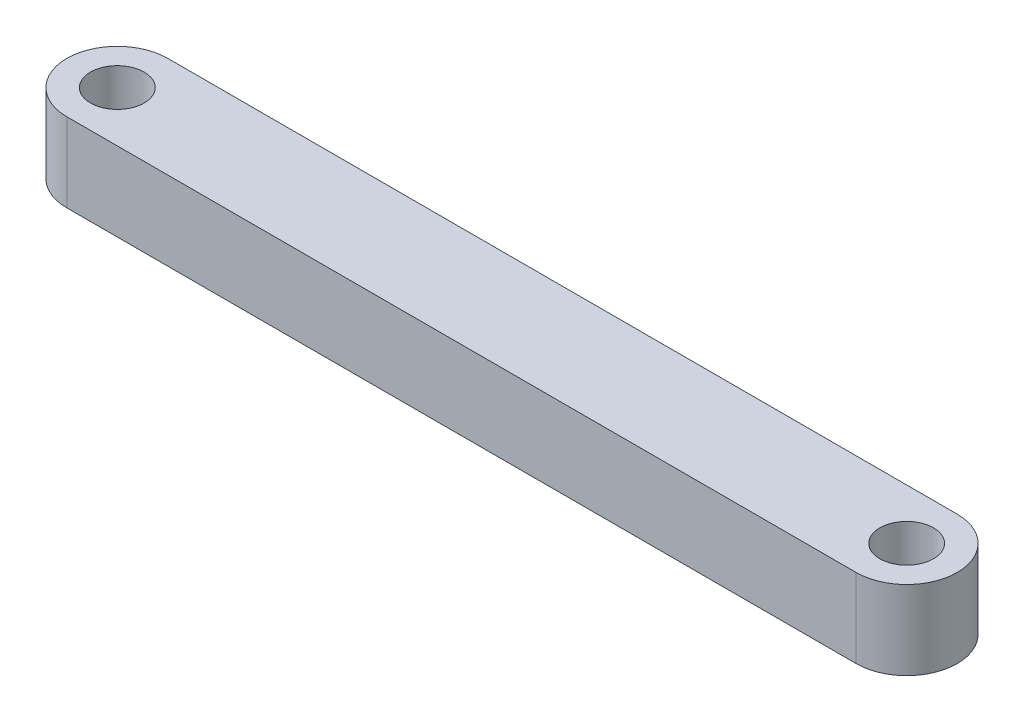
ISO-10303-21;
HEADER;
FILE_DESCRIPTION(('STEP AP214'),'2;1');
FILE_NAME('part.step','',(''),(''),'','','');
FILE_SCHEMA(('AUTOMOTIVE_DESIGN { 1 0 10303 214 1 1 1 1 }'));
ENDSEC;
DATA;
#1=APPLICATION_CONTEXT('core data for automotive mechanical design processes');
#2=APPLICATION_PROTOCOL_DEFINITION('international standard','automotive_design',2000,#1);
#3=PRODUCT_CONTEXT('',#1,'mechanical');
#4=PRODUCT('Part','Part','',(#3));
#5=PRODUCT_RELATED_PRODUCT_CATEGORY('part','',(#4));
#6=PRODUCT_DEFINITION_FORMATION('','',#4);
#7=PRODUCT_DEFINITION_CONTEXT('part definition',#1,'design');
#8=PRODUCT_DEFINITION('design','',#6,#7);
#9=PRODUCT_DEFINITION_SHAPE('','',#8);
#10=(LENGTH_UNIT() NAMED_UNIT(*) SI_UNIT(.MILLI.,.METRE.));
#11=(NAMED_UNIT(*) PLANE_ANGLE_UNIT() SI_UNIT($,.RADIAN.));
#12=(NAMED_UNIT(*) SI_UNIT($,.STERADIAN.) SOLID_ANGLE_UNIT());
#13=UNCERTAINTY_MEASURE_WITH_UNIT(LENGTH_MEASURE(1.E-05),#10,'distance_accuracy_value','');
#14=(GEOMETRIC_REPRESENTATION_CONTEXT(3) GLOBAL_UNCERTAINTY_ASSIGNED_CONTEXT((#13)) GLOBAL_UNIT_ASSIGNED_CONTEXT((#10,
#11,#12)) REPRESENTATION_CONTEXT('',''));
#15=CARTESIAN_POINT('',(0.,0.,0.));
#16=DIRECTION('',(0.,0.,1.));
#17=DIRECTION('',(1.,0.,0.));
#18=AXIS2_PLACEMENT_3D('',#15,#16,#17);
#19=CARTESIAN_POINT('',(0.,6.35,0.));
#20=DIRECTION('',(0.,1.,0.));
#21=DIRECTION('',(0.,0.,1.));
#22=AXIS2_PLACEMENT_3D('',#19,#20,#21);
#23=PLANE('',#22);
#24=CARTESIAN_POINT('',(0.,6.35,0.));
#25=DIRECTION('',(0.,1.,0.));
#26=DIRECTION('',(0.,0.,1.));
#27=AXIS2_PLACEMENT_3D('',#24,#25,#26);
#28=CIRCLE('',#27,2.159);
#29=CARTESIAN_POINT('',(0.,6.35,2.159));
#30=VERTEX_POINT('',#29);
#31=EDGE_CURVE('E106',#30,#30,#28,.T.);
#32=ORIENTED_EDGE('',*,*,#31,.F.);
#33=EDGE_LOOP('',(#32));
#34=FACE_BOUND('',#33,.T.);
#35=CARTESIAN_POINT('',(0.,6.35,0.));
#36=DIRECTION('',(0.,1.,0.));
#37=DIRECTION('',(0.,0.,1.));
#38=AXIS2_PLACEMENT_3D('',#35,#36,#37);
#39=CIRCLE('',#38,4.064);
#40=CARTESIAN_POINT('',(0.,6.35,-4.064));
#41=VERTEX_POINT('',#40);
#42=CARTESIAN_POINT('',(0.,6.35,4.064));
#43=VERTEX_POINT('',#42);
#44=EDGE_CURVE('E91',#41,#43,#39,.T.);
#45=ORIENTED_EDGE('',*,*,#44,.T.);
#46=DIRECTION('',(1.,0.,0.));
#47=VECTOR('',#46,1.);
#48=CARTESIAN_POINT('',(0.,6.35,4.064));
#49=LINE('',#48,#47);
#50=CARTESIAN_POINT('',(63.5,6.35,4.064));
#51=VERTEX_POINT('',#50);
#52=EDGE_CURVE('E86',#43,#51,#49,.T.);
#53=ORIENTED_EDGE('',*,*,#52,.T.);
#54=CARTESIAN_POINT('',(63.5,6.35,0.));
#55=DIRECTION('',(0.,1.,0.));
#56=DIRECTION('',(0.,0.,1.));
#57=AXIS2_PLACEMENT_3D('',#54,#55,#56);
#58=CIRCLE('',#57,4.064);
#59=CARTESIAN_POINT('',(63.5,6.35,-4.064));
#60=VERTEX_POINT('',#59);
#61=EDGE_CURVE('E89',#51,#60,#58,.T.);
#62=ORIENTED_EDGE('',*,*,#61,.T.);
#63=DIRECTION('',(-1.,0.,0.));
#64=VECTOR('',#63,1.);
#65=CARTESIAN_POINT('',(0.,6.35,-4.064));
#66=LINE('',#65,#64);
#67=EDGE_CURVE('E56',#60,#41,#66,.T.);
#68=ORIENTED_EDGE('',*,*,#67,.T.);
#69=EDGE_LOOP('',(#45,#53,#62,#68));
#70=FACE_BOUND('',#69,.T.);
#71=CARTESIAN_POINT('',(63.5,6.35,0.));
#72=DIRECTION('',(0.,1.,0.));
#73=DIRECTION('',(0.,0.,-1.));
#74=AXIS2_PLACEMENT_3D('',#71,#72,#73);
#75=CIRCLE('',#74,2.15899999999999);
#76=CARTESIAN_POINT('',(63.5,6.35,-2.15899999999999));
#77=VERTEX_POINT('',#76);
#78=EDGE_CURVE('E121',#77,#77,#75,.T.);
#79=ORIENTED_EDGE('',*,*,#78,.F.);
#80=EDGE_LOOP('',(#79));
#81=FACE_BOUND('',#80,.T.);
#82=ADVANCED_FACE('F39',(#34,#70,#81),#23,.T.);
#83=CARTESIAN_POINT('',(0.,0.,0.));
#84=DIRECTION('',(0.,1.,0.));
#85=DIRECTION('',(0.,0.,1.));
#86=AXIS2_PLACEMENT_3D('',#83,#84,#85);
#87=PLANE('',#86);
#88=CARTESIAN_POINT('',(0.,0.,0.));
#89=DIRECTION('',(0.,1.,0.));
#90=DIRECTION('',(0.,0.,1.));
#91=AXIS2_PLACEMENT_3D('',#88,#89,#90);
#92=CIRCLE('',#91,4.064);
#93=CARTESIAN_POINT('',(0.,0.,-4.064));
#94=VERTEX_POINT('',#93);
#95=CARTESIAN_POINT('',(0.,0.,4.064));
#96=VERTEX_POINT('',#95);
#97=EDGE_CURVE('E103',#94,#96,#92,.T.);
#98=ORIENTED_EDGE('',*,*,#97,.F.);
#99=DIRECTION('',(-1.,0.,0.));
#100=VECTOR('',#99,1.);
#101=CARTESIAN_POINT('',(0.,0.,-4.064));
#102=LINE('',#101,#100);
#103=CARTESIAN_POINT('',(63.5,0.,-4.064));
#104=VERTEX_POINT('',#103);
#105=EDGE_CURVE('E79',#104,#94,#102,.T.);
#106=ORIENTED_EDGE('',*,*,#105,.F.);
#107=CARTESIAN_POINT('',(63.5,0.,0.));
#108=DIRECTION('',(0.,1.,0.));
#109=DIRECTION('',(0.,0.,1.));
#110=AXIS2_PLACEMENT_3D('',#107,#108,#109);
#111=CIRCLE('',#110,4.064);
#112=CARTESIAN_POINT('',(63.5,0.,4.064));
#113=VERTEX_POINT('',#112);
#114=EDGE_CURVE('E73',#113,#104,#111,.T.);
#115=ORIENTED_EDGE('',*,*,#114,.F.);
#116=DIRECTION('',(1.,0.,0.));
#117=VECTOR('',#116,1.);
#118=CARTESIAN_POINT('',(0.,0.,4.064));
#119=LINE('',#118,#117);
#120=EDGE_CURVE('E95',#96,#113,#119,.T.);
#121=ORIENTED_EDGE('',*,*,#120,.F.);
#122=EDGE_LOOP('',(#98,#106,#115,#121));
#123=FACE_BOUND('',#122,.T.);
#124=CARTESIAN_POINT('',(0.,0.,0.));
#125=DIRECTION('',(0.,1.,0.));
#126=DIRECTION('',(0.,0.,1.));
#127=AXIS2_PLACEMENT_3D('',#124,#125,#126);
#128=CIRCLE('',#127,2.159);
#129=CARTESIAN_POINT('',(0.,0.,2.159));
#130=VERTEX_POINT('',#129);
#131=EDGE_CURVE('E118',#130,#130,#128,.T.);
#132=ORIENTED_EDGE('',*,*,#131,.T.);
#133=EDGE_LOOP('',(#132));
#134=FACE_BOUND('',#133,.T.);
#135=CARTESIAN_POINT('',(63.5,0.,0.));
#136=DIRECTION('',(0.,1.,0.));
#137=DIRECTION('',(0.,0.,-1.));
#138=AXIS2_PLACEMENT_3D('',#135,#136,#137);
#139=CIRCLE('',#138,2.15899999999999);
#140=CARTESIAN_POINT('',(63.5,0.,-2.15899999999999));
#141=VERTEX_POINT('',#140);
#142=EDGE_CURVE('E124',#141,#141,#139,.T.);
#143=ORIENTED_EDGE('',*,*,#142,.T.);
#144=EDGE_LOOP('',(#143));
#145=FACE_BOUND('',#144,.T.);
#146=ADVANCED_FACE('F114',(#123,#134,#145),#87,.F.);
#147=CARTESIAN_POINT('',(0.,6.35,0.));
#148=DIRECTION('',(0.,-1.,0.));
#149=DIRECTION('',(0.,0.,-1.));
#150=AXIS2_PLACEMENT_3D('',#147,#148,#149);
#151=CYLINDRICAL_SURFACE('',#150,4.064);
#152=ORIENTED_EDGE('',*,*,#97,.T.);
#153=DIRECTION('',(0.,-1.,0.));
#154=VECTOR('',#153,1.);
#155=CARTESIAN_POINT('',(0.,6.35,4.064));
#156=LINE('',#155,#154);
#157=EDGE_CURVE('E11',#43,#96,#156,.T.);
#158=ORIENTED_EDGE('',*,*,#157,.F.);
#159=ORIENTED_EDGE('',*,*,#44,.F.);
#160=DIRECTION('',(0.,-1.,0.));
#161=VECTOR('',#160,1.);
#162=CARTESIAN_POINT('',(0.,6.35,-4.064));
#163=LINE('',#162,#161);
#164=EDGE_CURVE('E99',#41,#94,#163,.T.);
#165=ORIENTED_EDGE('',*,*,#164,.T.);
#166=EDGE_LOOP('',(#152,#158,#159,#165));
#167=FACE_BOUND('',#166,.T.);
#168=ADVANCED_FACE('F41',(#167),#151,.T.);
#169=CARTESIAN_POINT('',(0.,6.35,4.064));
#170=DIRECTION('',(0.,0.,-1.));
#171=DIRECTION('',(-1.,0.,0.));
#172=AXIS2_PLACEMENT_3D('',#169,#170,#171);
#173=PLANE('',#172);
#174=ORIENTED_EDGE('',*,*,#120,.T.);
#175=DIRECTION('',(0.,-1.,0.));
#176=VECTOR('',#175,1.);
#177=CARTESIAN_POINT('',(63.5,6.35,4.064));
#178=LINE('',#177,#176);
#179=EDGE_CURVE('E48',#51,#113,#178,.T.);
#180=ORIENTED_EDGE('',*,*,#179,.F.);
#181=ORIENTED_EDGE('',*,*,#52,.F.);
#182=ORIENTED_EDGE('',*,*,#157,.T.);
#183=EDGE_LOOP('',(#174,#180,#181,#182));
#184=FACE_BOUND('',#183,.T.);
#185=ADVANCED_FACE('F94',(#184),#173,.F.);
#186=CARTESIAN_POINT('',(63.5,6.35,0.));
#187=DIRECTION('',(0.,-1.,0.));
#188=DIRECTION('',(0.,0.,-1.));
#189=AXIS2_PLACEMENT_3D('',#186,#187,#188);
#190=CYLINDRICAL_SURFACE('',#189,4.064);
#191=ORIENTED_EDGE('',*,*,#114,.T.);
#192=DIRECTION('',(0.,-1.,0.));
#193=VECTOR('',#192,1.);
#194=CARTESIAN_POINT('',(63.5,6.35,-4.064));
#195=LINE('',#194,#193);
#196=EDGE_CURVE('E96',#60,#104,#195,.T.);
#197=ORIENTED_EDGE('',*,*,#196,.F.);
#198=ORIENTED_EDGE('',*,*,#61,.F.);
#199=ORIENTED_EDGE('',*,*,#179,.T.);
#200=EDGE_LOOP('',(#191,#197,#198,#199));
#201=FACE_BOUND('',#200,.T.);
#202=ADVANCED_FACE('F97',(#201),#190,.T.);
#203=CARTESIAN_POINT('',(0.,6.35,-4.064));
#204=DIRECTION('',(0.,0.,1.));
#205=DIRECTION('',(1.,0.,0.));
#206=AXIS2_PLACEMENT_3D('',#203,#204,#205);
#207=PLANE('',#206);
#208=ORIENTED_EDGE('',*,*,#105,.T.);
#209=ORIENTED_EDGE('',*,*,#164,.F.);
#210=ORIENTED_EDGE('',*,*,#67,.F.);
#211=ORIENTED_EDGE('',*,*,#196,.T.);
#212=EDGE_LOOP('',(#208,#209,#210,#211));
#213=FACE_BOUND('',#212,.T.);
#214=ADVANCED_FACE('F111',(#213),#207,.F.);
#215=CARTESIAN_POINT('',(0.,6.35,0.));
#216=DIRECTION('',(0.,-1.,0.));
#217=DIRECTION('',(0.,0.,-1.));
#218=AXIS2_PLACEMENT_3D('',#215,#216,#217);
#219=CYLINDRICAL_SURFACE('',#218,2.159);
#220=ORIENTED_EDGE('',*,*,#31,.T.);
#221=EDGE_LOOP('',(#220));
#222=FACE_BOUND('',#221,.T.);
#223=ORIENTED_EDGE('',*,*,#131,.F.);
#224=EDGE_LOOP('',(#223));
#225=FACE_BOUND('',#224,.T.);
#226=ADVANCED_FACE('F141',(#222,#225),#219,.F.);
#227=CARTESIAN_POINT('',(63.5,6.35,0.));
#228=DIRECTION('',(0.,-1.,0.));
#229=DIRECTION('',(0.,0.,-1.));
#230=AXIS2_PLACEMENT_3D('',#227,#228,#229);
#231=CYLINDRICAL_SURFACE('',#230,2.15899999999999);
#232=ORIENTED_EDGE('',*,*,#78,.T.);
#233=EDGE_LOOP('',(#232));
#234=FACE_BOUND('',#233,.T.);
#235=ORIENTED_EDGE('',*,*,#142,.F.);
#236=EDGE_LOOP('',(#235));
#237=FACE_BOUND('',#236,.T.);
#238=ADVANCED_FACE('F130',(#234,#237),#231,.F.);
#239=CLOSED_SHELL('',(#82,#146,#168,#185,#202,#214,#226,#238));
#240=MANIFOLD_SOLID_BREP('B2',#239);
#241=ADVANCED_BREP_SHAPE_REPRESENTATION('',(#18,#240),#14);
#242=SHAPE_DEFINITION_REPRESENTATION(#9,#241);
ENDSEC;
END-ISO-10303-21;
